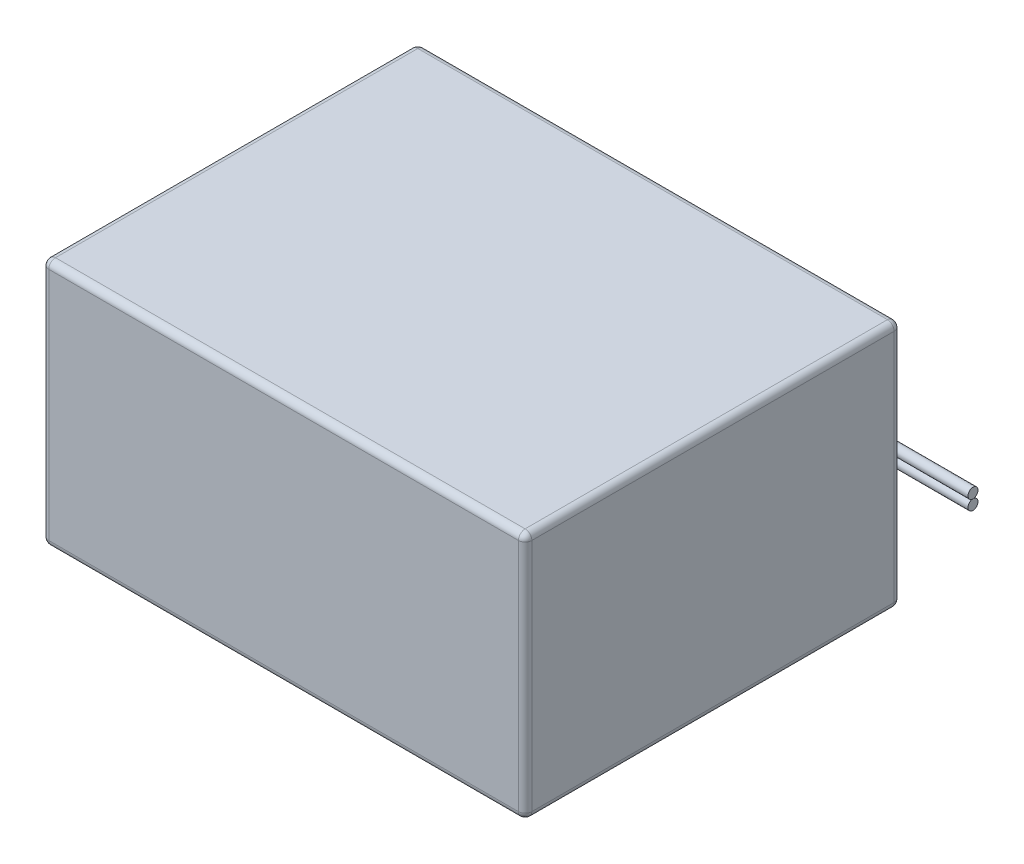
ISO-10303-21;
HEADER;
FILE_DESCRIPTION(('STEP AP214'),'2;1');
FILE_NAME('part.step','',(''),(''),'','','');
FILE_SCHEMA(('AUTOMOTIVE_DESIGN { 1 0 10303 214 1 1 1 1 }'));
ENDSEC;
DATA;
#1=APPLICATION_CONTEXT('core data for automotive mechanical design processes');
#2=APPLICATION_PROTOCOL_DEFINITION('international standard','automotive_design',2000,#1);
#3=PRODUCT_CONTEXT('',#1,'mechanical');
#4=PRODUCT('Part','Part','',(#3));
#5=PRODUCT_RELATED_PRODUCT_CATEGORY('part','',(#4));
#6=PRODUCT_DEFINITION_FORMATION('','',#4);
#7=PRODUCT_DEFINITION_CONTEXT('part definition',#1,'design');
#8=PRODUCT_DEFINITION('design','',#6,#7);
#9=PRODUCT_DEFINITION_SHAPE('','',#8);
#10=(LENGTH_UNIT() NAMED_UNIT(*) SI_UNIT(.MILLI.,.METRE.));
#11=(NAMED_UNIT(*) PLANE_ANGLE_UNIT() SI_UNIT($,.RADIAN.));
#12=(NAMED_UNIT(*) SI_UNIT($,.STERADIAN.) SOLID_ANGLE_UNIT());
#13=UNCERTAINTY_MEASURE_WITH_UNIT(LENGTH_MEASURE(1.E-05),#10,'distance_accuracy_value','');
#14=(GEOMETRIC_REPRESENTATION_CONTEXT(3) GLOBAL_UNCERTAINTY_ASSIGNED_CONTEXT((#13)) GLOBAL_UNIT_ASSIGNED_CONTEXT((#10,
#11,#12)) REPRESENTATION_CONTEXT('',''));
#15=CARTESIAN_POINT('',(0.,0.,0.));
#16=DIRECTION('',(0.,0.,1.));
#17=DIRECTION('',(1.,0.,0.));
#18=AXIS2_PLACEMENT_3D('',#15,#16,#17);
#19=CARTESIAN_POINT('',(31.,17.75,-28.75));
#20=DIRECTION('',(1.,0.,0.));
#21=DIRECTION('',(0.,0.,-1.));
#22=AXIS2_PLACEMENT_3D('',#19,#20,#21);
#23=CYLINDRICAL_SURFACE('',#22,0.750000000000002);
#24=CARTESIAN_POINT('',(31.,17.75,-28.75));
#25=DIRECTION('',(-1.,0.,0.));
#26=DIRECTION('',(0.,0.,1.));
#27=AXIS2_PLACEMENT_3D('',#24,#25,#26);
#28=CIRCLE('',#27,0.750000000000002);
#29=CARTESIAN_POINT('',(31.,17.75,-28.));
#30=VERTEX_POINT('',#29);
#31=EDGE_CURVE('E12',#30,#30,#28,.T.);
#32=ORIENTED_EDGE('',*,*,#31,.F.);
#33=EDGE_LOOP('',(#32));
#34=FACE_BOUND('',#33,.T.);
#35=CARTESIAN_POINT('',(46.,17.75,-28.75));
#36=DIRECTION('',(-1.,0.,0.));
#37=DIRECTION('',(0.,0.,1.));
#38=AXIS2_PLACEMENT_3D('',#35,#36,#37);
#39=CIRCLE('',#38,0.750000000000002);
#40=CARTESIAN_POINT('',(46.,17.75,-28.));
#41=VERTEX_POINT('',#40);
#42=EDGE_CURVE('E64',#41,#41,#39,.T.);
#43=ORIENTED_EDGE('',*,*,#42,.T.);
#44=EDGE_LOOP('',(#43));
#45=FACE_BOUND('',#44,.T.);
#46=ADVANCED_FACE('F58',(#34,#45),#23,.T.);
#47=CARTESIAN_POINT('',(31.,17.75,-28.75));
#48=DIRECTION('',(-1.,0.,0.));
#49=DIRECTION('',(0.,0.,1.));
#50=AXIS2_PLACEMENT_3D('',#47,#48,#49);
#51=PLANE('',#50);
#52=ORIENTED_EDGE('',*,*,#31,.T.);
#53=EDGE_LOOP('',(#52));
#54=FACE_BOUND('',#53,.T.);
#55=ADVANCED_FACE('F73',(#54),#51,.T.);
#56=CARTESIAN_POINT('',(46.,17.75,-28.75));
#57=DIRECTION('',(-1.,0.,0.));
#58=DIRECTION('',(0.,0.,1.));
#59=AXIS2_PLACEMENT_3D('',#56,#57,#58);
#60=PLANE('',#59);
#61=ORIENTED_EDGE('',*,*,#42,.F.);
#62=EDGE_LOOP('',(#61));
#63=FACE_BOUND('',#62,.T.);
#64=ADVANCED_FACE('F71',(#63),#60,.F.);
#65=CLOSED_SHELL('',(#46,#55,#64));
#66=MANIFOLD_SOLID_BREP('B2',#65);
#67=CARTESIAN_POINT('',(31.,19.25,-28.75));
#68=DIRECTION('',(1.,0.,0.));
#69=DIRECTION('',(0.,0.,-1.));
#70=AXIS2_PLACEMENT_3D('',#67,#68,#69);
#71=CYLINDRICAL_SURFACE('',#70,0.750000000000002);
#72=CARTESIAN_POINT('',(31.,19.25,-28.75));
#73=DIRECTION('',(-1.,0.,0.));
#74=DIRECTION('',(0.,0.,1.));
#75=AXIS2_PLACEMENT_3D('',#72,#73,#74);
#76=CIRCLE('',#75,0.750000000000002);
#77=CARTESIAN_POINT('',(31.,19.25,-28.));
#78=VERTEX_POINT('',#77);
#79=EDGE_CURVE('E57',#78,#78,#76,.T.);
#80=ORIENTED_EDGE('',*,*,#79,.F.);
#81=EDGE_LOOP('',(#80));
#82=FACE_BOUND('',#81,.T.);
#83=CARTESIAN_POINT('',(46.,19.25,-28.75));
#84=DIRECTION('',(-1.,0.,0.));
#85=DIRECTION('',(0.,0.,1.));
#86=AXIS2_PLACEMENT_3D('',#83,#84,#85);
#87=CIRCLE('',#86,0.750000000000002);
#88=CARTESIAN_POINT('',(46.,19.25,-28.));
#89=VERTEX_POINT('',#88);
#90=EDGE_CURVE('E120',#89,#89,#87,.T.);
#91=ORIENTED_EDGE('',*,*,#90,.T.);
#92=EDGE_LOOP('',(#91));
#93=FACE_BOUND('',#92,.T.);
#94=ADVANCED_FACE('F114',(#82,#93),#71,.T.);
#95=CARTESIAN_POINT('',(31.,19.25,-28.75));
#96=DIRECTION('',(-1.,0.,0.));
#97=DIRECTION('',(0.,0.,1.));
#98=AXIS2_PLACEMENT_3D('',#95,#96,#97);
#99=PLANE('',#98);
#100=ORIENTED_EDGE('',*,*,#79,.T.);
#101=EDGE_LOOP('',(#100));
#102=FACE_BOUND('',#101,.T.);
#103=ADVANCED_FACE('F129',(#102),#99,.T.);
#104=CARTESIAN_POINT('',(46.,19.25,-28.75));
#105=DIRECTION('',(-1.,0.,0.));
#106=DIRECTION('',(0.,0.,1.));
#107=AXIS2_PLACEMENT_3D('',#104,#105,#106);
#108=PLANE('',#107);
#109=ORIENTED_EDGE('',*,*,#90,.F.);
#110=EDGE_LOOP('',(#109));
#111=FACE_BOUND('',#110,.T.);
#112=ADVANCED_FACE('F127',(#111),#108,.F.);
#113=CLOSED_SHELL('',(#94,#103,#112));
#114=MANIFOLD_SOLID_BREP('B7',#113);
#115=CARTESIAN_POINT('',(36.,37.,-28.));
#116=DIRECTION('',(-1.,0.,0.));
#117=DIRECTION('',(0.,0.,1.));
#118=AXIS2_PLACEMENT_3D('',#115,#116,#117);
#119=PLANE('',#118);
#120=DIRECTION('',(0.,-1.,0.));
#121=VECTOR('',#120,1.);
#122=CARTESIAN_POINT('',(36.,37.,-27.));
#123=LINE('',#122,#121);
#124=CARTESIAN_POINT('',(36.,1.,-27.));
#125=VERTEX_POINT('',#124);
#126=CARTESIAN_POINT('',(36.,36.,-27.));
#127=VERTEX_POINT('',#126);
#128=EDGE_CURVE('E257',#125,#127,#123,.F.);
#129=ORIENTED_EDGE('',*,*,#128,.T.);
#130=DIRECTION('',(0.,0.,-1.));
#131=VECTOR('',#130,1.);
#132=CARTESIAN_POINT('',(36.,36.,28.));
#133=LINE('',#132,#131);
#134=CARTESIAN_POINT('',(36.,36.,27.));
#135=VERTEX_POINT('',#134);
#136=EDGE_CURVE('E294',#127,#135,#133,.F.);
#137=ORIENTED_EDGE('',*,*,#136,.T.);
#138=DIRECTION('',(0.,-1.,0.));
#139=VECTOR('',#138,1.);
#140=CARTESIAN_POINT('',(36.,37.,27.));
#141=LINE('',#140,#139);
#142=CARTESIAN_POINT('',(36.,1.,27.));
#143=VERTEX_POINT('',#142);
#144=EDGE_CURVE('E291',#135,#143,#141,.T.);
#145=ORIENTED_EDGE('',*,*,#144,.T.);
#146=DIRECTION('',(0.,0.,-1.));
#147=VECTOR('',#146,1.);
#148=CARTESIAN_POINT('',(36.,1.,-28.));
#149=LINE('',#148,#147);
#150=EDGE_CURVE('E286',#143,#125,#149,.T.);
#151=ORIENTED_EDGE('',*,*,#150,.T.);
#152=EDGE_LOOP('',(#129,#137,#145,#151));
#153=FACE_BOUND('',#152,.T.);
#154=ADVANCED_FACE('F161',(#153),#119,.F.);
#155=CARTESIAN_POINT('',(-36.,37.,-28.));
#156=DIRECTION('',(0.,0.,1.));
#157=DIRECTION('',(1.,0.,0.));
#158=AXIS2_PLACEMENT_3D('',#155,#156,#157);
#159=PLANE('',#158);
#160=DIRECTION('',(0.,-1.,0.));
#161=VECTOR('',#160,1.);
#162=CARTESIAN_POINT('',(-35.,37.,-28.));
#163=LINE('',#162,#161);
#164=CARTESIAN_POINT('',(-35.,1.,-28.));
#165=VERTEX_POINT('',#164);
#166=CARTESIAN_POINT('',(-35.,36.,-28.));
#167=VERTEX_POINT('',#166);
#168=EDGE_CURVE('E279',#165,#167,#163,.F.);
#169=ORIENTED_EDGE('',*,*,#168,.T.);
#170=DIRECTION('',(-1.,0.,0.));
#171=VECTOR('',#170,1.);
#172=CARTESIAN_POINT('',(36.,36.,-28.));
#173=LINE('',#172,#171);
#174=CARTESIAN_POINT('',(35.,36.,-28.));
#175=VERTEX_POINT('',#174);
#176=EDGE_CURVE('E283',#167,#175,#173,.F.);
#177=ORIENTED_EDGE('',*,*,#176,.T.);
#178=DIRECTION('',(0.,-1.,0.));
#179=VECTOR('',#178,1.);
#180=CARTESIAN_POINT('',(35.,37.,-28.));
#181=LINE('',#180,#179);
#182=CARTESIAN_POINT('',(35.,1.,-28.));
#183=VERTEX_POINT('',#182);
#184=EDGE_CURVE('E255',#175,#183,#181,.T.);
#185=ORIENTED_EDGE('',*,*,#184,.T.);
#186=DIRECTION('',(-1.,0.,0.));
#187=VECTOR('',#186,1.);
#188=CARTESIAN_POINT('',(-36.,1.,-28.));
#189=LINE('',#188,#187);
#190=EDGE_CURVE('E273',#183,#165,#189,.T.);
#191=ORIENTED_EDGE('',*,*,#190,.T.);
#192=EDGE_LOOP('',(#169,#177,#185,#191));
#193=FACE_BOUND('',#192,.T.);
#194=ADVANCED_FACE('F281',(#193),#159,.F.);
#195=CARTESIAN_POINT('',(-36.,37.,-28.));
#196=DIRECTION('',(1.,0.,0.));
#197=DIRECTION('',(0.,0.,-1.));
#198=AXIS2_PLACEMENT_3D('',#195,#196,#197);
#199=PLANE('',#198);
#200=DIRECTION('',(0.,-1.,0.));
#201=VECTOR('',#200,1.);
#202=CARTESIAN_POINT('',(-36.,37.,27.));
#203=LINE('',#202,#201);
#204=CARTESIAN_POINT('',(-36.,1.,27.));
#205=VERTEX_POINT('',#204);
#206=CARTESIAN_POINT('',(-36.,36.,27.));
#207=VERTEX_POINT('',#206);
#208=EDGE_CURVE('E298',#205,#207,#203,.F.);
#209=ORIENTED_EDGE('',*,*,#208,.T.);
#210=DIRECTION('',(0.,0.,1.));
#211=VECTOR('',#210,1.);
#212=CARTESIAN_POINT('',(-36.,36.,-28.));
#213=LINE('',#212,#211);
#214=CARTESIAN_POINT('',(-36.,36.,-27.));
#215=VERTEX_POINT('',#214);
#216=EDGE_CURVE('E303',#207,#215,#213,.F.);
#217=ORIENTED_EDGE('',*,*,#216,.T.);
#218=DIRECTION('',(0.,-1.,0.));
#219=VECTOR('',#218,1.);
#220=CARTESIAN_POINT('',(-36.,37.,-27.));
#221=LINE('',#220,#219);
#222=CARTESIAN_POINT('',(-36.,1.,-27.));
#223=VERTEX_POINT('',#222);
#224=EDGE_CURVE('E300',#215,#223,#221,.T.);
#225=ORIENTED_EDGE('',*,*,#224,.T.);
#226=DIRECTION('',(0.,0.,1.));
#227=VECTOR('',#226,1.);
#228=CARTESIAN_POINT('',(-36.,1.,-28.));
#229=LINE('',#228,#227);
#230=EDGE_CURVE('E296',#223,#205,#229,.T.);
#231=ORIENTED_EDGE('',*,*,#230,.T.);
#232=EDGE_LOOP('',(#209,#217,#225,#231));
#233=FACE_BOUND('',#232,.T.);
#234=ADVANCED_FACE('F408',(#233),#199,.F.);
#235=CARTESIAN_POINT('',(-36.,37.,28.));
#236=DIRECTION('',(0.,0.,-1.));
#237=DIRECTION('',(-1.,0.,0.));
#238=AXIS2_PLACEMENT_3D('',#235,#236,#237);
#239=PLANE('',#238);
#240=DIRECTION('',(0.,-1.,0.));
#241=VECTOR('',#240,1.);
#242=CARTESIAN_POINT('',(35.,37.,28.));
#243=LINE('',#242,#241);
#244=CARTESIAN_POINT('',(35.,1.,28.));
#245=VERTEX_POINT('',#244);
#246=CARTESIAN_POINT('',(35.,36.,28.));
#247=VERTEX_POINT('',#246);
#248=EDGE_CURVE('E307',#245,#247,#243,.F.);
#249=ORIENTED_EDGE('',*,*,#248,.T.);
#250=DIRECTION('',(1.,0.,0.));
#251=VECTOR('',#250,1.);
#252=CARTESIAN_POINT('',(-36.,36.,28.));
#253=LINE('',#252,#251);
#254=CARTESIAN_POINT('',(-35.,36.,28.));
#255=VERTEX_POINT('',#254);
#256=EDGE_CURVE('E312',#247,#255,#253,.F.);
#257=ORIENTED_EDGE('',*,*,#256,.T.);
#258=DIRECTION('',(0.,-1.,0.));
#259=VECTOR('',#258,1.);
#260=CARTESIAN_POINT('',(-35.,37.,28.));
#261=LINE('',#260,#259);
#262=CARTESIAN_POINT('',(-35.,1.,28.));
#263=VERTEX_POINT('',#262);
#264=EDGE_CURVE('E309',#255,#263,#261,.T.);
#265=ORIENTED_EDGE('',*,*,#264,.T.);
#266=DIRECTION('',(1.,0.,0.));
#267=VECTOR('',#266,1.);
#268=CARTESIAN_POINT('',(-36.,1.,28.));
#269=LINE('',#268,#267);
#270=EDGE_CURVE('E305',#263,#245,#269,.T.);
#271=ORIENTED_EDGE('',*,*,#270,.T.);
#272=EDGE_LOOP('',(#249,#257,#265,#271));
#273=FACE_BOUND('',#272,.T.);
#274=ADVANCED_FACE('F419',(#273),#239,.F.);
#275=CARTESIAN_POINT('',(0.,37.,0.));
#276=DIRECTION('',(0.,1.,0.));
#277=DIRECTION('',(0.,0.,1.));
#278=AXIS2_PLACEMENT_3D('',#275,#276,#277);
#279=PLANE('',#278);
#280=DIRECTION('',(0.,0.,1.));
#281=VECTOR('',#280,1.);
#282=CARTESIAN_POINT('',(-35.,37.,28.));
#283=LINE('',#282,#281);
#284=CARTESIAN_POINT('',(-35.,37.,-27.));
#285=VERTEX_POINT('',#284);
#286=CARTESIAN_POINT('',(-35.,37.,27.));
#287=VERTEX_POINT('',#286);
#288=EDGE_CURVE('E318',#285,#287,#283,.T.);
#289=ORIENTED_EDGE('',*,*,#288,.T.);
#290=DIRECTION('',(1.,0.,0.));
#291=VECTOR('',#290,1.);
#292=CARTESIAN_POINT('',(36.,37.,27.));
#293=LINE('',#292,#291);
#294=CARTESIAN_POINT('',(35.,37.,27.));
#295=VERTEX_POINT('',#294);
#296=EDGE_CURVE('E320',#287,#295,#293,.T.);
#297=ORIENTED_EDGE('',*,*,#296,.T.);
#298=DIRECTION('',(0.,0.,-1.));
#299=VECTOR('',#298,1.);
#300=CARTESIAN_POINT('',(35.,37.,-28.));
#301=LINE('',#300,#299);
#302=CARTESIAN_POINT('',(35.,37.,-27.));
#303=VERTEX_POINT('',#302);
#304=EDGE_CURVE('E314',#295,#303,#301,.T.);
#305=ORIENTED_EDGE('',*,*,#304,.T.);
#306=DIRECTION('',(-1.,0.,0.));
#307=VECTOR('',#306,1.);
#308=CARTESIAN_POINT('',(-36.,37.,-27.));
#309=LINE('',#308,#307);
#310=EDGE_CURVE('E316',#303,#285,#309,.T.);
#311=ORIENTED_EDGE('',*,*,#310,.T.);
#312=EDGE_LOOP('',(#289,#297,#305,#311));
#313=FACE_BOUND('',#312,.T.);
#314=ADVANCED_FACE('F400',(#313),#279,.T.);
#315=CARTESIAN_POINT('',(0.,0.,0.));
#316=DIRECTION('',(0.,1.,0.));
#317=DIRECTION('',(0.,0.,1.));
#318=AXIS2_PLACEMENT_3D('',#315,#316,#317);
#319=PLANE('',#318);
#320=DIRECTION('',(0.,0.,1.));
#321=VECTOR('',#320,1.);
#322=CARTESIAN_POINT('',(-35.,0.,0.));
#323=LINE('',#322,#321);
#324=CARTESIAN_POINT('',(-35.,0.,27.));
#325=VERTEX_POINT('',#324);
#326=CARTESIAN_POINT('',(-35.,0.,-27.));
#327=VERTEX_POINT('',#326);
#328=EDGE_CURVE('E170',#325,#327,#323,.F.);
#329=ORIENTED_EDGE('',*,*,#328,.T.);
#330=DIRECTION('',(-1.,0.,0.));
#331=VECTOR('',#330,1.);
#332=CARTESIAN_POINT('',(0.,0.,-27.));
#333=LINE('',#332,#331);
#334=CARTESIAN_POINT('',(35.,0.,-27.));
#335=VERTEX_POINT('',#334);
#336=EDGE_CURVE('E112',#327,#335,#333,.F.);
#337=ORIENTED_EDGE('',*,*,#336,.T.);
#338=DIRECTION('',(0.,0.,-1.));
#339=VECTOR('',#338,1.);
#340=CARTESIAN_POINT('',(35.,0.,0.));
#341=LINE('',#340,#339);
#342=CARTESIAN_POINT('',(35.,0.,27.));
#343=VERTEX_POINT('',#342);
#344=EDGE_CURVE('E323',#335,#343,#341,.F.);
#345=ORIENTED_EDGE('',*,*,#344,.T.);
#346=DIRECTION('',(1.,0.,0.));
#347=VECTOR('',#346,1.);
#348=CARTESIAN_POINT('',(0.,0.,27.));
#349=LINE('',#348,#347);
#350=EDGE_CURVE('E181',#343,#325,#349,.F.);
#351=ORIENTED_EDGE('',*,*,#350,.T.);
#352=EDGE_LOOP('',(#329,#337,#345,#351));
#353=FACE_BOUND('',#352,.T.);
#354=ADVANCED_FACE('F645',(#353),#319,.F.);
#355=CARTESIAN_POINT('',(-35.,37.,27.));
#356=DIRECTION('',(0.,-1.,0.));
#357=DIRECTION('',(0.,0.,-1.));
#358=AXIS2_PLACEMENT_3D('',#355,#356,#357);
#359=CYLINDRICAL_SURFACE('',#358,1.);
#360=CARTESIAN_POINT('',(-35.,36.,27.));
#361=DIRECTION('',(0.,1.,0.));
#362=DIRECTION('',(0.,0.,1.));
#363=AXIS2_PLACEMENT_3D('',#360,#361,#362);
#364=CIRCLE('',#363,1.);
#365=EDGE_CURVE('E165',#207,#255,#364,.T.);
#366=ORIENTED_EDGE('',*,*,#365,.F.);
#367=ORIENTED_EDGE('',*,*,#208,.F.);
#368=CARTESIAN_POINT('',(-35.,1.,27.));
#369=DIRECTION('',(0.,-1.,0.));
#370=DIRECTION('',(0.,0.,-1.));
#371=AXIS2_PLACEMENT_3D('',#368,#369,#370);
#372=CIRCLE('',#371,1.);
#373=EDGE_CURVE('E377',#263,#205,#372,.T.);
#374=ORIENTED_EDGE('',*,*,#373,.F.);
#375=ORIENTED_EDGE('',*,*,#264,.F.);
#376=EDGE_LOOP('',(#366,#367,#374,#375));
#377=FACE_BOUND('',#376,.T.);
#378=ADVANCED_FACE('F163',(#377),#359,.T.);
#379=CARTESIAN_POINT('',(-35.,36.,27.));
#380=DIRECTION('',(0.,0.,1.));
#381=DIRECTION('',(1.,0.,0.));
#382=AXIS2_PLACEMENT_3D('',#379,#380,#381);
#383=SPHERICAL_SURFACE('',#382,1.);
#384=CARTESIAN_POINT('',(-35.,36.,27.));
#385=DIRECTION('',(0.,0.,1.));
#386=DIRECTION('',(1.,0.,0.));
#387=AXIS2_PLACEMENT_3D('',#384,#385,#386);
#388=CIRCLE('',#387,1.);
#389=EDGE_CURVE('E372',#207,#287,#388,.F.);
#390=ORIENTED_EDGE('',*,*,#389,.F.);
#391=ORIENTED_EDGE('',*,*,#365,.T.);
#392=CARTESIAN_POINT('',(-35.,36.,27.));
#393=DIRECTION('',(-1.,0.,0.));
#394=DIRECTION('',(0.,0.,1.));
#395=AXIS2_PLACEMENT_3D('',#392,#393,#394);
#396=CIRCLE('',#395,1.);
#397=EDGE_CURVE('E375',#287,#255,#396,.F.);
#398=ORIENTED_EDGE('',*,*,#397,.F.);
#399=EDGE_LOOP('',(#390,#391,#398));
#400=FACE_BOUND('',#399,.T.);
#401=ADVANCED_FACE('F388',(#400),#383,.T.);
#402=CARTESIAN_POINT('',(-35.,1.,27.));
#403=DIRECTION('',(-1.,0.,0.));
#404=DIRECTION('',(0.,-1.,0.));
#405=AXIS2_PLACEMENT_3D('',#402,#403,#404);
#406=SPHERICAL_SURFACE('',#405,1.);
#407=CARTESIAN_POINT('',(-35.,1.,27.));
#408=DIRECTION('',(-1.,0.,0.));
#409=DIRECTION('',(0.,0.,1.));
#410=AXIS2_PLACEMENT_3D('',#407,#408,#409);
#411=CIRCLE('',#410,1.);
#412=EDGE_CURVE('E367',#263,#325,#411,.F.);
#413=ORIENTED_EDGE('',*,*,#412,.F.);
#414=ORIENTED_EDGE('',*,*,#373,.T.);
#415=CARTESIAN_POINT('',(-35.,1.,27.));
#416=DIRECTION('',(0.,0.,1.));
#417=DIRECTION('',(1.,0.,0.));
#418=AXIS2_PLACEMENT_3D('',#415,#416,#417);
#419=CIRCLE('',#418,1.);
#420=EDGE_CURVE('E369',#325,#205,#419,.F.);
#421=ORIENTED_EDGE('',*,*,#420,.F.);
#422=EDGE_LOOP('',(#413,#414,#421));
#423=FACE_BOUND('',#422,.T.);
#424=ADVANCED_FACE('F618',(#423),#406,.T.);
#425=CARTESIAN_POINT('',(0.,36.,27.));
#426=DIRECTION('',(-1.,0.,0.));
#427=DIRECTION('',(0.,0.,1.));
#428=AXIS2_PLACEMENT_3D('',#425,#426,#427);
#429=CYLINDRICAL_SURFACE('',#428,1.);
#430=ORIENTED_EDGE('',*,*,#397,.T.);
#431=ORIENTED_EDGE('',*,*,#256,.F.);
#432=CARTESIAN_POINT('',(35.,36.,27.));
#433=DIRECTION('',(1.,0.,0.));
#434=DIRECTION('',(0.,0.,-1.));
#435=AXIS2_PLACEMENT_3D('',#432,#433,#434);
#436=CIRCLE('',#435,1.);
#437=EDGE_CURVE('E361',#295,#247,#436,.T.);
#438=ORIENTED_EDGE('',*,*,#437,.F.);
#439=ORIENTED_EDGE('',*,*,#296,.F.);
#440=EDGE_LOOP('',(#430,#431,#438,#439));
#441=FACE_BOUND('',#440,.T.);
#442=ADVANCED_FACE('F396',(#441),#429,.T.);
#443=CARTESIAN_POINT('',(-35.,36.,0.));
#444=DIRECTION('',(0.,0.,-1.));
#445=DIRECTION('',(-1.,0.,0.));
#446=AXIS2_PLACEMENT_3D('',#443,#444,#445);
#447=CYLINDRICAL_SURFACE('',#446,1.);
#448=ORIENTED_EDGE('',*,*,#389,.T.);
#449=ORIENTED_EDGE('',*,*,#288,.F.);
#450=CARTESIAN_POINT('',(-35.,36.,-27.));
#451=DIRECTION('',(0.,0.,-1.));
#452=DIRECTION('',(-1.,0.,0.));
#453=AXIS2_PLACEMENT_3D('',#450,#451,#452);
#454=CIRCLE('',#453,1.);
#455=EDGE_CURVE('E358',#215,#285,#454,.T.);
#456=ORIENTED_EDGE('',*,*,#455,.F.);
#457=ORIENTED_EDGE('',*,*,#216,.F.);
#458=EDGE_LOOP('',(#448,#449,#456,#457));
#459=FACE_BOUND('',#458,.T.);
#460=ADVANCED_FACE('F405',(#459),#447,.T.);
#461=CARTESIAN_POINT('',(-35.,37.,-27.));
#462=DIRECTION('',(0.,-1.,0.));
#463=DIRECTION('',(0.,0.,-1.));
#464=AXIS2_PLACEMENT_3D('',#461,#462,#463);
#465=CYLINDRICAL_SURFACE('',#464,1.);
#466=CARTESIAN_POINT('',(-35.,1.,-27.));
#467=DIRECTION('',(0.,-1.,0.));
#468=DIRECTION('',(0.,0.,-1.));
#469=AXIS2_PLACEMENT_3D('',#466,#467,#468);
#470=CIRCLE('',#469,1.);
#471=EDGE_CURVE('E352',#223,#165,#470,.T.);
#472=ORIENTED_EDGE('',*,*,#471,.F.);
#473=ORIENTED_EDGE('',*,*,#224,.F.);
#474=CARTESIAN_POINT('',(-35.,36.,-27.));
#475=DIRECTION('',(0.,1.,0.));
#476=DIRECTION('',(0.,0.,1.));
#477=AXIS2_PLACEMENT_3D('',#474,#475,#476);
#478=CIRCLE('',#477,1.);
#479=EDGE_CURVE('E355',#167,#215,#478,.T.);
#480=ORIENTED_EDGE('',*,*,#479,.F.);
#481=ORIENTED_EDGE('',*,*,#168,.F.);
#482=EDGE_LOOP('',(#472,#473,#480,#481));
#483=FACE_BOUND('',#482,.T.);
#484=ADVANCED_FACE('F412',(#483),#465,.T.);
#485=CARTESIAN_POINT('',(-35.,1.,-28.));
#486=DIRECTION('',(0.,0.,1.));
#487=DIRECTION('',(1.,0.,0.));
#488=AXIS2_PLACEMENT_3D('',#485,#486,#487);
#489=CYLINDRICAL_SURFACE('',#488,1.);
#490=ORIENTED_EDGE('',*,*,#420,.T.);
#491=ORIENTED_EDGE('',*,*,#230,.F.);
#492=CARTESIAN_POINT('',(-35.,1.,-27.));
#493=DIRECTION('',(0.,0.,-1.));
#494=DIRECTION('',(-1.,0.,0.));
#495=AXIS2_PLACEMENT_3D('',#492,#493,#494);
#496=CIRCLE('',#495,1.);
#497=EDGE_CURVE('E350',#327,#223,#496,.T.);
#498=ORIENTED_EDGE('',*,*,#497,.F.);
#499=ORIENTED_EDGE('',*,*,#328,.F.);
#500=EDGE_LOOP('',(#490,#491,#498,#499));
#501=FACE_BOUND('',#500,.T.);
#502=ADVANCED_FACE('F417',(#501),#489,.T.);
#503=CARTESIAN_POINT('',(-36.,1.,27.));
#504=DIRECTION('',(1.,0.,0.));
#505=DIRECTION('',(0.,0.,-1.));
#506=AXIS2_PLACEMENT_3D('',#503,#504,#505);
#507=CYLINDRICAL_SURFACE('',#506,1.);
#508=ORIENTED_EDGE('',*,*,#412,.T.);
#509=ORIENTED_EDGE('',*,*,#350,.F.);
#510=CARTESIAN_POINT('',(35.,1.,27.));
#511=DIRECTION('',(1.,0.,0.));
#512=DIRECTION('',(0.,0.,-1.));
#513=AXIS2_PLACEMENT_3D('',#510,#511,#512);
#514=CIRCLE('',#513,1.);
#515=EDGE_CURVE('E347',#245,#343,#514,.T.);
#516=ORIENTED_EDGE('',*,*,#515,.F.);
#517=ORIENTED_EDGE('',*,*,#270,.F.);
#518=EDGE_LOOP('',(#508,#509,#516,#517));
#519=FACE_BOUND('',#518,.T.);
#520=ADVANCED_FACE('F428',(#519),#507,.T.);
#521=CARTESIAN_POINT('',(35.,37.,27.));
#522=DIRECTION('',(0.,-1.,0.));
#523=DIRECTION('',(0.,0.,-1.));
#524=AXIS2_PLACEMENT_3D('',#521,#522,#523);
#525=CYLINDRICAL_SURFACE('',#524,1.);
#526=CARTESIAN_POINT('',(35.,36.,27.));
#527=DIRECTION('',(0.,1.,0.));
#528=DIRECTION('',(0.,0.,1.));
#529=AXIS2_PLACEMENT_3D('',#526,#527,#528);
#530=CIRCLE('',#529,1.);
#531=EDGE_CURVE('E364',#247,#135,#530,.T.);
#532=ORIENTED_EDGE('',*,*,#531,.F.);
#533=ORIENTED_EDGE('',*,*,#248,.F.);
#534=CARTESIAN_POINT('',(35.,1.,27.));
#535=DIRECTION('',(0.,-1.,0.));
#536=DIRECTION('',(0.,0.,-1.));
#537=AXIS2_PLACEMENT_3D('',#534,#535,#536);
#538=CIRCLE('',#537,1.);
#539=EDGE_CURVE('E344',#143,#245,#538,.T.);
#540=ORIENTED_EDGE('',*,*,#539,.F.);
#541=ORIENTED_EDGE('',*,*,#144,.F.);
#542=EDGE_LOOP('',(#532,#533,#540,#541));
#543=FACE_BOUND('',#542,.T.);
#544=ADVANCED_FACE('F424',(#543),#525,.T.);
#545=CARTESIAN_POINT('',(35.,36.,27.));
#546=DIRECTION('',(0.,0.,1.));
#547=DIRECTION('',(1.,0.,0.));
#548=AXIS2_PLACEMENT_3D('',#545,#546,#547);
#549=SPHERICAL_SURFACE('',#548,1.);
#550=ORIENTED_EDGE('',*,*,#437,.T.);
#551=ORIENTED_EDGE('',*,*,#531,.T.);
#552=CARTESIAN_POINT('',(35.,36.,27.));
#553=DIRECTION('',(0.,0.,1.));
#554=DIRECTION('',(1.,0.,0.));
#555=AXIS2_PLACEMENT_3D('',#552,#553,#554);
#556=CIRCLE('',#555,1.);
#557=EDGE_CURVE('E341',#295,#135,#556,.F.);
#558=ORIENTED_EDGE('',*,*,#557,.F.);
#559=EDGE_LOOP('',(#550,#551,#558));
#560=FACE_BOUND('',#559,.T.);
#561=ADVANCED_FACE('F438',(#560),#549,.T.);
#562=CARTESIAN_POINT('',(-35.,36.,-27.));
#563=DIRECTION('',(-1.,0.,0.));
#564=DIRECTION('',(0.,0.,1.));
#565=AXIS2_PLACEMENT_3D('',#562,#563,#564);
#566=SPHERICAL_SURFACE('',#565,1.);
#567=ORIENTED_EDGE('',*,*,#479,.T.);
#568=ORIENTED_EDGE('',*,*,#455,.T.);
#569=CARTESIAN_POINT('',(-35.,36.,-27.));
#570=DIRECTION('',(-1.,0.,0.));
#571=DIRECTION('',(0.,0.,1.));
#572=AXIS2_PLACEMENT_3D('',#569,#570,#571);
#573=CIRCLE('',#572,1.);
#574=EDGE_CURVE('E338',#167,#285,#573,.F.);
#575=ORIENTED_EDGE('',*,*,#574,.F.);
#576=EDGE_LOOP('',(#567,#568,#575));
#577=FACE_BOUND('',#576,.T.);
#578=ADVANCED_FACE('F448',(#577),#566,.T.);
#579=CARTESIAN_POINT('',(-35.,1.,-27.));
#580=DIRECTION('',(-1.,0.,0.));
#581=DIRECTION('',(0.,-1.,0.));
#582=AXIS2_PLACEMENT_3D('',#579,#580,#581);
#583=SPHERICAL_SURFACE('',#582,1.);
#584=ORIENTED_EDGE('',*,*,#497,.T.);
#585=ORIENTED_EDGE('',*,*,#471,.T.);
#586=CARTESIAN_POINT('',(-35.,1.,-27.));
#587=DIRECTION('',(-1.,0.,0.));
#588=DIRECTION('',(0.,0.,1.));
#589=AXIS2_PLACEMENT_3D('',#586,#587,#588);
#590=CIRCLE('',#589,1.);
#591=EDGE_CURVE('E276',#327,#165,#590,.F.);
#592=ORIENTED_EDGE('',*,*,#591,.F.);
#593=EDGE_LOOP('',(#584,#585,#592));
#594=FACE_BOUND('',#593,.T.);
#595=ADVANCED_FACE('F450',(#594),#583,.T.);
#596=CARTESIAN_POINT('',(35.,1.,27.));
#597=DIRECTION('',(0.,0.,1.));
#598=DIRECTION('',(0.,-1.,0.));
#599=AXIS2_PLACEMENT_3D('',#596,#597,#598);
#600=SPHERICAL_SURFACE('',#599,1.);
#601=ORIENTED_EDGE('',*,*,#539,.T.);
#602=ORIENTED_EDGE('',*,*,#515,.T.);
#603=CARTESIAN_POINT('',(35.,1.,27.));
#604=DIRECTION('',(0.,0.,1.));
#605=DIRECTION('',(1.,0.,0.));
#606=AXIS2_PLACEMENT_3D('',#603,#604,#605);
#607=CIRCLE('',#606,1.);
#608=EDGE_CURVE('E334',#143,#343,#607,.F.);
#609=ORIENTED_EDGE('',*,*,#608,.F.);
#610=EDGE_LOOP('',(#601,#602,#609));
#611=FACE_BOUND('',#610,.T.);
#612=ADVANCED_FACE('F430',(#611),#600,.T.);
#613=CARTESIAN_POINT('',(35.,36.,0.));
#614=DIRECTION('',(0.,0.,1.));
#615=DIRECTION('',(1.,0.,0.));
#616=AXIS2_PLACEMENT_3D('',#613,#614,#615);
#617=CYLINDRICAL_SURFACE('',#616,1.);
#618=ORIENTED_EDGE('',*,*,#557,.T.);
#619=ORIENTED_EDGE('',*,*,#136,.F.);
#620=CARTESIAN_POINT('',(35.,36.,-27.));
#621=DIRECTION('',(0.,0.,-1.));
#622=DIRECTION('',(-1.,0.,0.));
#623=AXIS2_PLACEMENT_3D('',#620,#621,#622);
#624=CIRCLE('',#623,1.);
#625=EDGE_CURVE('E331',#303,#127,#624,.T.);
#626=ORIENTED_EDGE('',*,*,#625,.F.);
#627=ORIENTED_EDGE('',*,*,#304,.F.);
#628=EDGE_LOOP('',(#618,#619,#626,#627));
#629=FACE_BOUND('',#628,.T.);
#630=ADVANCED_FACE('F440',(#629),#617,.T.);
#631=CARTESIAN_POINT('',(0.,36.,-27.));
#632=DIRECTION('',(1.,0.,0.));
#633=DIRECTION('',(0.,0.,-1.));
#634=AXIS2_PLACEMENT_3D('',#631,#632,#633);
#635=CYLINDRICAL_SURFACE('',#634,1.);
#636=ORIENTED_EDGE('',*,*,#574,.T.);
#637=ORIENTED_EDGE('',*,*,#310,.F.);
#638=CARTESIAN_POINT('',(35.,36.,-27.));
#639=DIRECTION('',(1.,0.,0.));
#640=DIRECTION('',(0.,0.,-1.));
#641=AXIS2_PLACEMENT_3D('',#638,#639,#640);
#642=CIRCLE('',#641,1.);
#643=EDGE_CURVE('E270',#175,#303,#642,.T.);
#644=ORIENTED_EDGE('',*,*,#643,.F.);
#645=ORIENTED_EDGE('',*,*,#176,.F.);
#646=EDGE_LOOP('',(#636,#637,#644,#645));
#647=FACE_BOUND('',#646,.T.);
#648=ADVANCED_FACE('F446',(#647),#635,.T.);
#649=CARTESIAN_POINT('',(-36.,1.,-27.));
#650=DIRECTION('',(-1.,0.,0.));
#651=DIRECTION('',(0.,0.,1.));
#652=AXIS2_PLACEMENT_3D('',#649,#650,#651);
#653=CYLINDRICAL_SURFACE('',#652,1.);
#654=ORIENTED_EDGE('',*,*,#591,.T.);
#655=ORIENTED_EDGE('',*,*,#190,.F.);
#656=CARTESIAN_POINT('',(35.,1.,-27.));
#657=DIRECTION('',(1.,0.,0.));
#658=DIRECTION('',(0.,0.,-1.));
#659=AXIS2_PLACEMENT_3D('',#656,#657,#658);
#660=CIRCLE('',#659,1.);
#661=EDGE_CURVE('E262',#335,#183,#660,.T.);
#662=ORIENTED_EDGE('',*,*,#661,.F.);
#663=ORIENTED_EDGE('',*,*,#336,.F.);
#664=EDGE_LOOP('',(#654,#655,#662,#663));
#665=FACE_BOUND('',#664,.T.);
#666=ADVANCED_FACE('F274',(#665),#653,.T.);
#667=CARTESIAN_POINT('',(35.,1.,-28.));
#668=DIRECTION('',(0.,0.,-1.));
#669=DIRECTION('',(-1.,0.,0.));
#670=AXIS2_PLACEMENT_3D('',#667,#668,#669);
#671=CYLINDRICAL_SURFACE('',#670,1.);
#672=ORIENTED_EDGE('',*,*,#608,.T.);
#673=ORIENTED_EDGE('',*,*,#344,.F.);
#674=CARTESIAN_POINT('',(35.,1.,-27.));
#675=DIRECTION('',(0.,0.,-1.));
#676=DIRECTION('',(-1.,0.,0.));
#677=AXIS2_PLACEMENT_3D('',#674,#675,#676);
#678=CIRCLE('',#677,1.);
#679=EDGE_CURVE('E266',#125,#335,#678,.T.);
#680=ORIENTED_EDGE('',*,*,#679,.F.);
#681=ORIENTED_EDGE('',*,*,#150,.F.);
#682=EDGE_LOOP('',(#672,#673,#680,#681));
#683=FACE_BOUND('',#682,.T.);
#684=ADVANCED_FACE('F433',(#683),#671,.T.);
#685=CARTESIAN_POINT('',(35.,36.,-27.));
#686=DIRECTION('',(0.,1.,0.));
#687=DIRECTION('',(0.,0.,1.));
#688=AXIS2_PLACEMENT_3D('',#685,#686,#687);
#689=SPHERICAL_SURFACE('',#688,1.);
#690=ORIENTED_EDGE('',*,*,#643,.T.);
#691=ORIENTED_EDGE('',*,*,#625,.T.);
#692=CARTESIAN_POINT('',(35.,36.,-27.));
#693=DIRECTION('',(0.,1.,0.));
#694=DIRECTION('',(0.,0.,1.));
#695=AXIS2_PLACEMENT_3D('',#692,#693,#694);
#696=CIRCLE('',#695,1.);
#697=EDGE_CURVE('E259',#175,#127,#696,.F.);
#698=ORIENTED_EDGE('',*,*,#697,.F.);
#699=EDGE_LOOP('',(#690,#691,#698));
#700=FACE_BOUND('',#699,.T.);
#701=ADVANCED_FACE('F444',(#700),#689,.T.);
#702=CARTESIAN_POINT('',(35.,1.,-27.));
#703=DIRECTION('',(0.,-1.,0.));
#704=DIRECTION('',(0.,0.,-1.));
#705=AXIS2_PLACEMENT_3D('',#702,#703,#704);
#706=SPHERICAL_SURFACE('',#705,1.);
#707=ORIENTED_EDGE('',*,*,#679,.T.);
#708=ORIENTED_EDGE('',*,*,#661,.T.);
#709=CARTESIAN_POINT('',(35.,1.,-27.));
#710=DIRECTION('',(0.,-1.,0.));
#711=DIRECTION('',(0.,0.,-1.));
#712=AXIS2_PLACEMENT_3D('',#709,#710,#711);
#713=CIRCLE('',#712,1.);
#714=EDGE_CURVE('E251',#125,#183,#713,.F.);
#715=ORIENTED_EDGE('',*,*,#714,.F.);
#716=EDGE_LOOP('',(#707,#708,#715));
#717=FACE_BOUND('',#716,.T.);
#718=ADVANCED_FACE('F264',(#717),#706,.T.);
#719=CARTESIAN_POINT('',(35.,37.,-27.));
#720=DIRECTION('',(0.,-1.,0.));
#721=DIRECTION('',(0.,0.,-1.));
#722=AXIS2_PLACEMENT_3D('',#719,#720,#721);
#723=CYLINDRICAL_SURFACE('',#722,1.);
#724=ORIENTED_EDGE('',*,*,#697,.T.);
#725=ORIENTED_EDGE('',*,*,#128,.F.);
#726=ORIENTED_EDGE('',*,*,#714,.T.);
#727=ORIENTED_EDGE('',*,*,#184,.F.);
#728=EDGE_LOOP('',(#724,#725,#726,#727));
#729=FACE_BOUND('',#728,.T.);
#730=ADVANCED_FACE('F253',(#729),#723,.T.);
#731=CLOSED_SHELL('',(#154,#194,#234,#274,#314,#354,#378,#401,#424,#442,#460,#484,#502,#520,
#544,#561,#578,#595,#612,#630,#648,#666,#684,#701,#718,#730));
#732=MANIFOLD_SOLID_BREP('B52',#731);
#733=ADVANCED_BREP_SHAPE_REPRESENTATION('',(#18,#66,#114,#732),#14);
#734=SHAPE_DEFINITION_REPRESENTATION(#9,#733);
ENDSEC;
END-ISO-10303-21;
